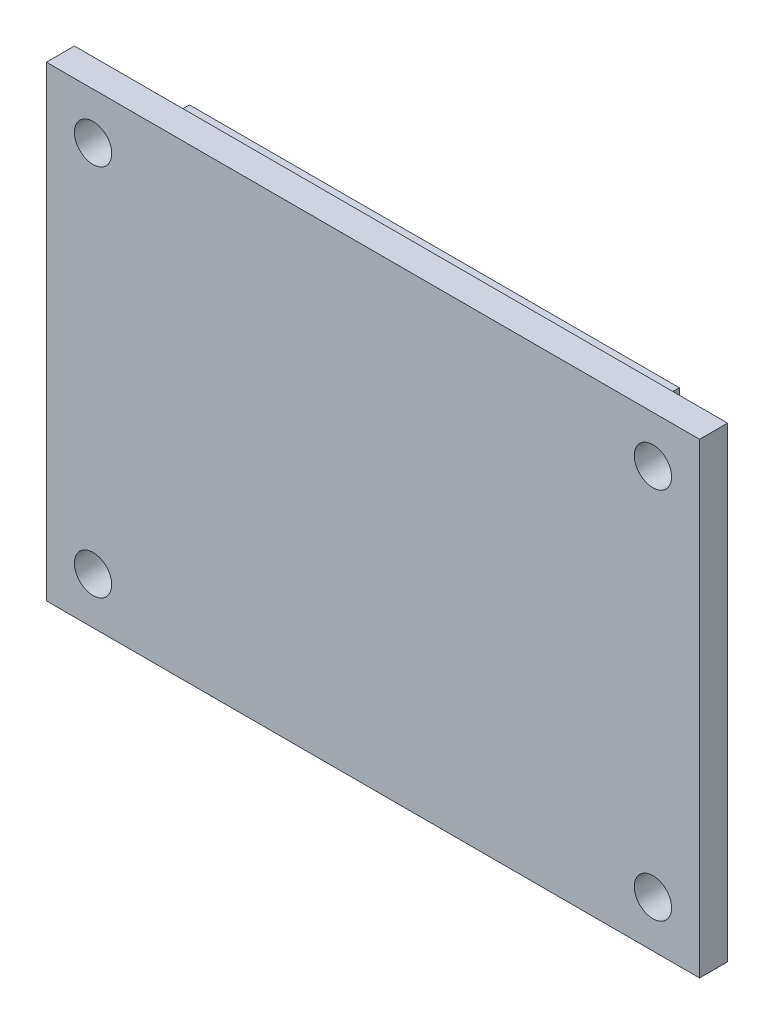
ISO-10303-21;
HEADER;
FILE_DESCRIPTION(('STEP AP214'),'2;1');
FILE_NAME('part.step','',(''),(''),'','','');
FILE_SCHEMA(('AUTOMOTIVE_DESIGN { 1 0 10303 214 1 1 1 1 }'));
ENDSEC;
DATA;
#1=APPLICATION_CONTEXT('core data for automotive mechanical design processes');
#2=APPLICATION_PROTOCOL_DEFINITION('international standard','automotive_design',2000,#1);
#3=PRODUCT_CONTEXT('',#1,'mechanical');
#4=PRODUCT('Part','Part','',(#3));
#5=PRODUCT_RELATED_PRODUCT_CATEGORY('part','',(#4));
#6=PRODUCT_DEFINITION_FORMATION('','',#4);
#7=PRODUCT_DEFINITION_CONTEXT('part definition',#1,'design');
#8=PRODUCT_DEFINITION('design','',#6,#7);
#9=PRODUCT_DEFINITION_SHAPE('','',#8);
#10=(LENGTH_UNIT() NAMED_UNIT(*) SI_UNIT(.MILLI.,.METRE.));
#11=(NAMED_UNIT(*) PLANE_ANGLE_UNIT() SI_UNIT($,.RADIAN.));
#12=(NAMED_UNIT(*) SI_UNIT($,.STERADIAN.) SOLID_ANGLE_UNIT());
#13=UNCERTAINTY_MEASURE_WITH_UNIT(LENGTH_MEASURE(1.E-05),#10,'distance_accuracy_value','');
#14=(GEOMETRIC_REPRESENTATION_CONTEXT(3) GLOBAL_UNCERTAINTY_ASSIGNED_CONTEXT((#13)) GLOBAL_UNIT_ASSIGNED_CONTEXT((#10,
#11,#12)) REPRESENTATION_CONTEXT('',''));
#15=CARTESIAN_POINT('',(0.,0.,0.));
#16=DIRECTION('',(0.,0.,1.));
#17=DIRECTION('',(1.,0.,0.));
#18=AXIS2_PLACEMENT_3D('',#15,#16,#17);
#19=CARTESIAN_POINT('',(0.,0.,-26.));
#20=DIRECTION('',(0.,0.,1.));
#21=DIRECTION('',(1.,0.,0.));
#22=AXIS2_PLACEMENT_3D('',#19,#20,#21);
#23=PLANE('',#22);
#24=DIRECTION('',(0.,1.,0.));
#25=VECTOR('',#24,1.);
#26=CARTESIAN_POINT('',(-49.8285823288315,0.,-26.));
#27=LINE('',#26,#25);
#28=CARTESIAN_POINT('',(-49.8285823288315,-40.8047707864554,-26.));
#29=VERTEX_POINT('',#28);
#30=CARTESIAN_POINT('',(-49.8285823288315,9.19522921354461,-26.));
#31=VERTEX_POINT('',#30);
#32=EDGE_CURVE('E146',#29,#31,#27,.T.);
#33=ORIENTED_EDGE('',*,*,#32,.T.);
#34=DIRECTION('',(-1.,0.,0.));
#35=VECTOR('',#34,1.);
#36=CARTESIAN_POINT('',(0.,9.19522921354462,-26.));
#37=LINE('',#36,#35);
#38=CARTESIAN_POINT('',(20.1714176711685,9.19522921354462,-26.));
#39=VERTEX_POINT('',#38);
#40=EDGE_CURVE('E153',#39,#31,#37,.T.);
#41=ORIENTED_EDGE('',*,*,#40,.F.);
#42=DIRECTION('',(0.,1.,0.));
#43=VECTOR('',#42,1.);
#44=CARTESIAN_POINT('',(20.1714176711685,0.,-26.));
#45=LINE('',#44,#43);
#46=CARTESIAN_POINT('',(20.1714176711685,-40.8047707864554,-26.));
#47=VERTEX_POINT('',#46);
#48=EDGE_CURVE('E150',#47,#39,#45,.T.);
#49=ORIENTED_EDGE('',*,*,#48,.F.);
#50=DIRECTION('',(-1.,0.,0.));
#51=VECTOR('',#50,1.);
#52=CARTESIAN_POINT('',(0.,-40.8047707864554,-26.));
#53=LINE('',#52,#51);
#54=EDGE_CURVE('E148',#47,#29,#53,.T.);
#55=ORIENTED_EDGE('',*,*,#54,.T.);
#56=EDGE_LOOP('',(#33,#41,#49,#55));
#57=FACE_BOUND('',#56,.T.);
#58=CARTESIAN_POINT('',(15.1714176711685,-35.8047707864554,-26.));
#59=DIRECTION('',(0.,0.,1.));
#60=DIRECTION('',(1.,0.,0.));
#61=AXIS2_PLACEMENT_3D('',#58,#59,#60);
#62=CIRCLE('',#61,2.00000000000001);
#63=CARTESIAN_POINT('',(17.1714176711685,-35.8047707864554,-26.));
#64=VERTEX_POINT('',#63);
#65=EDGE_CURVE('E143',#64,#64,#62,.T.);
#66=ORIENTED_EDGE('',*,*,#65,.T.);
#67=EDGE_LOOP('',(#66));
#68=FACE_BOUND('',#67,.T.);
#69=CARTESIAN_POINT('',(-44.8285823288315,4.19522921354461,-26.));
#70=DIRECTION('',(0.,0.,1.));
#71=DIRECTION('',(1.,0.,0.));
#72=AXIS2_PLACEMENT_3D('',#69,#70,#71);
#73=CIRCLE('',#72,2.);
#74=CARTESIAN_POINT('',(-42.8285823288315,4.19522921354461,-26.));
#75=VERTEX_POINT('',#74);
#76=EDGE_CURVE('E140',#75,#75,#73,.T.);
#77=ORIENTED_EDGE('',*,*,#76,.T.);
#78=EDGE_LOOP('',(#77));
#79=FACE_BOUND('',#78,.T.);
#80=CARTESIAN_POINT('',(-44.8285823288315,-35.8047707864554,-26.));
#81=DIRECTION('',(0.,0.,1.));
#82=DIRECTION('',(1.,0.,0.));
#83=AXIS2_PLACEMENT_3D('',#80,#81,#82);
#84=CIRCLE('',#83,2.);
#85=CARTESIAN_POINT('',(-42.8285823288315,-35.8047707864554,-26.));
#86=VERTEX_POINT('',#85);
#87=EDGE_CURVE('E136',#86,#86,#84,.T.);
#88=ORIENTED_EDGE('',*,*,#87,.T.);
#89=EDGE_LOOP('',(#88));
#90=FACE_BOUND('',#89,.T.);
#91=CARTESIAN_POINT('',(15.1714176711685,4.19522921354461,-26.));
#92=DIRECTION('',(0.,0.,1.));
#93=DIRECTION('',(1.,0.,0.));
#94=AXIS2_PLACEMENT_3D('',#91,#92,#93);
#95=CIRCLE('',#94,2.00000000000001);
#96=CARTESIAN_POINT('',(17.1714176711685,4.19522921354461,-26.));
#97=VERTEX_POINT('',#96);
#98=EDGE_CURVE('E133',#97,#97,#95,.T.);
#99=ORIENTED_EDGE('',*,*,#98,.T.);
#100=EDGE_LOOP('',(#99));
#101=FACE_BOUND('',#100,.T.);
#102=DIRECTION('',(0.,-1.,0.));
#103=VECTOR('',#102,1.);
#104=CARTESIAN_POINT('',(10.1714176711685,-10.8047707864554,-26.));
#105=LINE('',#104,#103);
#106=CARTESIAN_POINT('',(10.1714176711685,5.06522921354461,-26.));
#107=VERTEX_POINT('',#106);
#108=CARTESIAN_POINT('',(10.1714176711685,-10.8047707864554,-26.));
#109=VERTEX_POINT('',#108);
#110=EDGE_CURVE('E123',#107,#109,#105,.T.);
#111=ORIENTED_EDGE('',*,*,#110,.F.);
#112=DIRECTION('',(1.,0.,0.));
#113=VECTOR('',#112,1.);
#114=CARTESIAN_POINT('',(10.1714176711685,5.06522921354461,-26.));
#115=LINE('',#114,#113);
#116=CARTESIAN_POINT('',(-42.3285823288315,5.06522921354461,-26.));
#117=VERTEX_POINT('',#116);
#118=EDGE_CURVE('E120',#117,#107,#115,.T.);
#119=ORIENTED_EDGE('',*,*,#118,.F.);
#120=DIRECTION('',(0.,1.,0.));
#121=VECTOR('',#120,1.);
#122=CARTESIAN_POINT('',(-42.3285823288315,-10.8047707864554,-26.));
#123=LINE('',#122,#121);
#124=CARTESIAN_POINT('',(-42.3285823288315,-10.8047707864554,-26.));
#125=VERTEX_POINT('',#124);
#126=EDGE_CURVE('E59',#125,#117,#123,.T.);
#127=ORIENTED_EDGE('',*,*,#126,.F.);
#128=DIRECTION('',(-1.,0.,0.));
#129=VECTOR('',#128,1.);
#130=CARTESIAN_POINT('',(10.1714176711685,-10.8047707864554,-26.));
#131=LINE('',#130,#129);
#132=EDGE_CURVE('E54',#109,#125,#131,.T.);
#133=ORIENTED_EDGE('',*,*,#132,.F.);
#134=EDGE_LOOP('',(#111,#119,#127,#133));
#135=FACE_BOUND('',#134,.T.);
#136=ADVANCED_FACE('F37',(#57,#68,#79,#90,#101,#135),#23,.F.);
#137=CARTESIAN_POINT('',(-49.8285823288315,0.,-26.));
#138=DIRECTION('',(1.,0.,0.));
#139=DIRECTION('',(0.,0.,-1.));
#140=AXIS2_PLACEMENT_3D('',#137,#138,#139);
#141=PLANE('',#140);
#142=DIRECTION('',(0.,1.,0.));
#143=VECTOR('',#142,1.);
#144=CARTESIAN_POINT('',(-49.8285823288315,0.,-23.));
#145=LINE('',#144,#143);
#146=CARTESIAN_POINT('',(-49.8285823288315,-40.8047707864554,-23.));
#147=VERTEX_POINT('',#146);
#148=CARTESIAN_POINT('',(-49.8285823288315,9.19522921354461,-23.));
#149=VERTEX_POINT('',#148);
#150=EDGE_CURVE('E164',#147,#149,#145,.T.);
#151=ORIENTED_EDGE('',*,*,#150,.T.);
#152=DIRECTION('',(0.,0.,1.));
#153=VECTOR('',#152,1.);
#154=CARTESIAN_POINT('',(-49.8285823288315,9.19522921354461,-26.));
#155=LINE('',#154,#153);
#156=EDGE_CURVE('E11',#31,#149,#155,.T.);
#157=ORIENTED_EDGE('',*,*,#156,.F.);
#158=ORIENTED_EDGE('',*,*,#32,.F.);
#159=DIRECTION('',(0.,0.,1.));
#160=VECTOR('',#159,1.);
#161=CARTESIAN_POINT('',(-49.8285823288315,-40.8047707864554,-26.));
#162=LINE('',#161,#160);
#163=EDGE_CURVE('E41',#29,#147,#162,.T.);
#164=ORIENTED_EDGE('',*,*,#163,.T.);
#165=EDGE_LOOP('',(#151,#157,#158,#164));
#166=FACE_BOUND('',#165,.T.);
#167=ADVANCED_FACE('F183',(#166),#141,.F.);
#168=CARTESIAN_POINT('',(0.,9.19522921354462,-26.));
#169=DIRECTION('',(0.,1.,0.));
#170=DIRECTION('',(-1.,0.,0.));
#171=AXIS2_PLACEMENT_3D('',#168,#169,#170);
#172=PLANE('',#171);
#173=DIRECTION('',(-1.,0.,0.));
#174=VECTOR('',#173,1.);
#175=CARTESIAN_POINT('',(0.,9.19522921354462,-23.));
#176=LINE('',#175,#174);
#177=CARTESIAN_POINT('',(20.1714176711685,9.19522921354462,-23.));
#178=VERTEX_POINT('',#177);
#179=EDGE_CURVE('E137',#178,#149,#176,.T.);
#180=ORIENTED_EDGE('',*,*,#179,.F.);
#181=DIRECTION('',(0.,0.,1.));
#182=VECTOR('',#181,1.);
#183=CARTESIAN_POINT('',(20.1714176711685,9.19522921354462,-26.));
#184=LINE('',#183,#182);
#185=EDGE_CURVE('E46',#39,#178,#184,.T.);
#186=ORIENTED_EDGE('',*,*,#185,.F.);
#187=ORIENTED_EDGE('',*,*,#40,.T.);
#188=ORIENTED_EDGE('',*,*,#156,.T.);
#189=EDGE_LOOP('',(#180,#186,#187,#188));
#190=FACE_BOUND('',#189,.T.);
#191=ADVANCED_FACE('F190',(#190),#172,.T.);
#192=CARTESIAN_POINT('',(20.1714176711685,0.,-26.));
#193=DIRECTION('',(1.,0.,0.));
#194=DIRECTION('',(0.,0.,-1.));
#195=AXIS2_PLACEMENT_3D('',#192,#193,#194);
#196=PLANE('',#195);
#197=DIRECTION('',(0.,1.,0.));
#198=VECTOR('',#197,1.);
#199=CARTESIAN_POINT('',(20.1714176711685,0.,-23.));
#200=LINE('',#199,#198);
#201=CARTESIAN_POINT('',(20.1714176711685,-40.8047707864554,-23.));
#202=VERTEX_POINT('',#201);
#203=EDGE_CURVE('E169',#202,#178,#200,.T.);
#204=ORIENTED_EDGE('',*,*,#203,.F.);
#205=DIRECTION('',(0.,0.,1.));
#206=VECTOR('',#205,1.);
#207=CARTESIAN_POINT('',(20.1714176711685,-40.8047707864554,-26.));
#208=LINE('',#207,#206);
#209=EDGE_CURVE('E174',#47,#202,#208,.T.);
#210=ORIENTED_EDGE('',*,*,#209,.F.);
#211=ORIENTED_EDGE('',*,*,#48,.T.);
#212=ORIENTED_EDGE('',*,*,#185,.T.);
#213=EDGE_LOOP('',(#204,#210,#211,#212));
#214=FACE_BOUND('',#213,.T.);
#215=ADVANCED_FACE('F217',(#214),#196,.T.);
#216=CARTESIAN_POINT('',(15.1714176711685,-35.8047707864554,-26.));
#217=DIRECTION('',(0.,0.,1.));
#218=DIRECTION('',(1.,0.,0.));
#219=AXIS2_PLACEMENT_3D('',#216,#217,#218);
#220=CYLINDRICAL_SURFACE('',#219,2.00000000000001);
#221=ORIENTED_EDGE('',*,*,#65,.F.);
#222=EDGE_LOOP('',(#221));
#223=FACE_BOUND('',#222,.T.);
#224=CARTESIAN_POINT('',(15.1714176711685,-35.8047707864554,-23.));
#225=DIRECTION('',(0.,0.,1.));
#226=DIRECTION('',(1.,0.,0.));
#227=AXIS2_PLACEMENT_3D('',#224,#225,#226);
#228=CIRCLE('',#227,2.00000000000001);
#229=CARTESIAN_POINT('',(17.1714176711685,-35.8047707864554,-23.));
#230=VERTEX_POINT('',#229);
#231=EDGE_CURVE('E161',#230,#230,#228,.T.);
#232=ORIENTED_EDGE('',*,*,#231,.T.);
#233=EDGE_LOOP('',(#232));
#234=FACE_BOUND('',#233,.T.);
#235=ADVANCED_FACE('F219',(#223,#234),#220,.F.);
#236=CARTESIAN_POINT('',(-44.8285823288315,4.19522921354461,-26.));
#237=DIRECTION('',(0.,0.,1.));
#238=DIRECTION('',(1.,0.,0.));
#239=AXIS2_PLACEMENT_3D('',#236,#237,#238);
#240=CYLINDRICAL_SURFACE('',#239,2.);
#241=ORIENTED_EDGE('',*,*,#76,.F.);
#242=EDGE_LOOP('',(#241));
#243=FACE_BOUND('',#242,.T.);
#244=CARTESIAN_POINT('',(-44.8285823288315,4.19522921354461,-23.));
#245=DIRECTION('',(0.,0.,1.));
#246=DIRECTION('',(1.,0.,0.));
#247=AXIS2_PLACEMENT_3D('',#244,#245,#246);
#248=CIRCLE('',#247,2.);
#249=CARTESIAN_POINT('',(-42.8285823288315,4.19522921354461,-23.));
#250=VERTEX_POINT('',#249);
#251=EDGE_CURVE('E158',#250,#250,#248,.T.);
#252=ORIENTED_EDGE('',*,*,#251,.T.);
#253=EDGE_LOOP('',(#252));
#254=FACE_BOUND('',#253,.T.);
#255=ADVANCED_FACE('F224',(#243,#254),#240,.F.);
#256=CARTESIAN_POINT('',(-44.8285823288315,-35.8047707864554,-26.));
#257=DIRECTION('',(0.,0.,1.));
#258=DIRECTION('',(1.,0.,0.));
#259=AXIS2_PLACEMENT_3D('',#256,#257,#258);
#260=CYLINDRICAL_SURFACE('',#259,2.);
#261=ORIENTED_EDGE('',*,*,#87,.F.);
#262=EDGE_LOOP('',(#261));
#263=FACE_BOUND('',#262,.T.);
#264=CARTESIAN_POINT('',(-44.8285823288315,-35.8047707864554,-23.));
#265=DIRECTION('',(0.,0.,1.));
#266=DIRECTION('',(1.,0.,0.));
#267=AXIS2_PLACEMENT_3D('',#264,#265,#266);
#268=CIRCLE('',#267,2.);
#269=CARTESIAN_POINT('',(-42.8285823288315,-35.8047707864554,-23.));
#270=VERTEX_POINT('',#269);
#271=EDGE_CURVE('E127',#270,#270,#268,.T.);
#272=ORIENTED_EDGE('',*,*,#271,.T.);
#273=EDGE_LOOP('',(#272));
#274=FACE_BOUND('',#273,.T.);
#275=ADVANCED_FACE('F204',(#263,#274),#260,.F.);
#276=CARTESIAN_POINT('',(15.1714176711685,4.19522921354461,-26.));
#277=DIRECTION('',(0.,0.,1.));
#278=DIRECTION('',(1.,0.,0.));
#279=AXIS2_PLACEMENT_3D('',#276,#277,#278);
#280=CYLINDRICAL_SURFACE('',#279,2.00000000000001);
#281=ORIENTED_EDGE('',*,*,#98,.F.);
#282=EDGE_LOOP('',(#281));
#283=FACE_BOUND('',#282,.T.);
#284=CARTESIAN_POINT('',(15.1714176711685,4.19522921354461,-23.));
#285=DIRECTION('',(0.,0.,1.));
#286=DIRECTION('',(1.,0.,0.));
#287=AXIS2_PLACEMENT_3D('',#284,#285,#286);
#288=CIRCLE('',#287,2.00000000000001);
#289=CARTESIAN_POINT('',(17.1714176711685,4.19522921354461,-23.));
#290=VERTEX_POINT('',#289);
#291=EDGE_CURVE('E124',#290,#290,#288,.T.);
#292=ORIENTED_EDGE('',*,*,#291,.T.);
#293=EDGE_LOOP('',(#292));
#294=FACE_BOUND('',#293,.T.);
#295=ADVANCED_FACE('F39',(#283,#294),#280,.F.);
#296=CARTESIAN_POINT('',(0.,-40.8047707864554,-26.));
#297=DIRECTION('',(0.,1.,0.));
#298=DIRECTION('',(-1.,0.,0.));
#299=AXIS2_PLACEMENT_3D('',#296,#297,#298);
#300=PLANE('',#299);
#301=DIRECTION('',(-1.,0.,0.));
#302=VECTOR('',#301,1.);
#303=CARTESIAN_POINT('',(0.,-40.8047707864554,-23.));
#304=LINE('',#303,#302);
#305=EDGE_CURVE('E167',#202,#147,#304,.T.);
#306=ORIENTED_EDGE('',*,*,#305,.T.);
#307=ORIENTED_EDGE('',*,*,#163,.F.);
#308=ORIENTED_EDGE('',*,*,#54,.F.);
#309=ORIENTED_EDGE('',*,*,#209,.T.);
#310=EDGE_LOOP('',(#306,#307,#308,#309));
#311=FACE_BOUND('',#310,.T.);
#312=ADVANCED_FACE('F195',(#311),#300,.F.);
#313=CARTESIAN_POINT('',(0.,0.,-23.));
#314=DIRECTION('',(0.,0.,1.));
#315=DIRECTION('',(1.,0.,0.));
#316=AXIS2_PLACEMENT_3D('',#313,#314,#315);
#317=PLANE('',#316);
#318=ORIENTED_EDGE('',*,*,#291,.F.);
#319=EDGE_LOOP('',(#318));
#320=FACE_BOUND('',#319,.T.);
#321=ORIENTED_EDGE('',*,*,#271,.F.);
#322=EDGE_LOOP('',(#321));
#323=FACE_BOUND('',#322,.T.);
#324=ORIENTED_EDGE('',*,*,#251,.F.);
#325=EDGE_LOOP('',(#324));
#326=FACE_BOUND('',#325,.T.);
#327=ORIENTED_EDGE('',*,*,#231,.F.);
#328=EDGE_LOOP('',(#327));
#329=FACE_BOUND('',#328,.T.);
#330=ORIENTED_EDGE('',*,*,#150,.F.);
#331=ORIENTED_EDGE('',*,*,#305,.F.);
#332=ORIENTED_EDGE('',*,*,#203,.T.);
#333=ORIENTED_EDGE('',*,*,#179,.T.);
#334=EDGE_LOOP('',(#330,#331,#332,#333));
#335=FACE_BOUND('',#334,.T.);
#336=ADVANCED_FACE('F186',(#320,#323,#326,#329,#335),#317,.T.);
#337=CARTESIAN_POINT('',(10.1714176711685,-10.8047707864554,-30.83));
#338=DIRECTION('',(-1.,0.,0.));
#339=DIRECTION('',(0.,-1.,0.));
#340=AXIS2_PLACEMENT_3D('',#337,#338,#339);
#341=PLANE('',#340);
#342=ORIENTED_EDGE('',*,*,#110,.T.);
#343=DIRECTION('',(0.,0.,1.));
#344=VECTOR('',#343,1.);
#345=CARTESIAN_POINT('',(10.1714176711685,-10.8047707864554,-30.83));
#346=LINE('',#345,#344);
#347=CARTESIAN_POINT('',(10.1714176711685,-10.8047707864554,-30.83));
#348=VERTEX_POINT('',#347);
#349=EDGE_CURVE('E104',#348,#109,#346,.T.);
#350=ORIENTED_EDGE('',*,*,#349,.F.);
#351=DIRECTION('',(0.,-1.,0.));
#352=VECTOR('',#351,1.);
#353=CARTESIAN_POINT('',(10.1714176711685,-10.8047707864554,-30.83));
#354=LINE('',#353,#352);
#355=CARTESIAN_POINT('',(10.1714176711685,5.06522921354461,-30.83));
#356=VERTEX_POINT('',#355);
#357=EDGE_CURVE('E111',#356,#348,#354,.T.);
#358=ORIENTED_EDGE('',*,*,#357,.F.);
#359=DIRECTION('',(0.,0.,1.));
#360=VECTOR('',#359,1.);
#361=CARTESIAN_POINT('',(10.1714176711685,5.06522921354461,-30.83));
#362=LINE('',#361,#360);
#363=EDGE_CURVE('E255',#356,#107,#362,.T.);
#364=ORIENTED_EDGE('',*,*,#363,.T.);
#365=EDGE_LOOP('',(#342,#350,#358,#364));
#366=FACE_BOUND('',#365,.T.);
#367=ADVANCED_FACE('F122',(#366),#341,.F.);
#368=CARTESIAN_POINT('',(10.1714176711685,-10.8047707864554,-30.83));
#369=DIRECTION('',(0.,1.,0.));
#370=DIRECTION('',(0.,0.,1.));
#371=AXIS2_PLACEMENT_3D('',#368,#369,#370);
#372=PLANE('',#371);
#373=ORIENTED_EDGE('',*,*,#132,.T.);
#374=DIRECTION('',(0.,0.,1.));
#375=VECTOR('',#374,1.);
#376=CARTESIAN_POINT('',(-42.3285823288315,-10.8047707864554,-30.83));
#377=LINE('',#376,#375);
#378=CARTESIAN_POINT('',(-42.3285823288315,-10.8047707864554,-30.83));
#379=VERTEX_POINT('',#378);
#380=EDGE_CURVE('E107',#379,#125,#377,.T.);
#381=ORIENTED_EDGE('',*,*,#380,.F.);
#382=DIRECTION('',(-1.,0.,0.));
#383=VECTOR('',#382,1.);
#384=CARTESIAN_POINT('',(10.1714176711685,-10.8047707864554,-30.83));
#385=LINE('',#384,#383);
#386=EDGE_CURVE('E100',#348,#379,#385,.T.);
#387=ORIENTED_EDGE('',*,*,#386,.F.);
#388=ORIENTED_EDGE('',*,*,#349,.T.);
#389=EDGE_LOOP('',(#373,#381,#387,#388));
#390=FACE_BOUND('',#389,.T.);
#391=ADVANCED_FACE('F102',(#390),#372,.F.);
#392=CARTESIAN_POINT('',(-42.3285823288315,-10.8047707864554,-30.83));
#393=DIRECTION('',(1.,0.,0.));
#394=DIRECTION('',(0.,0.,-1.));
#395=AXIS2_PLACEMENT_3D('',#392,#393,#394);
#396=PLANE('',#395);
#397=ORIENTED_EDGE('',*,*,#126,.T.);
#398=DIRECTION('',(0.,0.,1.));
#399=VECTOR('',#398,1.);
#400=CARTESIAN_POINT('',(-42.3285823288315,5.06522921354461,-30.83));
#401=LINE('',#400,#399);
#402=CARTESIAN_POINT('',(-42.3285823288315,5.06522921354461,-30.83));
#403=VERTEX_POINT('',#402);
#404=EDGE_CURVE('E129',#403,#117,#401,.T.);
#405=ORIENTED_EDGE('',*,*,#404,.F.);
#406=DIRECTION('',(0.,1.,0.));
#407=VECTOR('',#406,1.);
#408=CARTESIAN_POINT('',(-42.3285823288315,-10.8047707864554,-30.83));
#409=LINE('',#408,#407);
#410=EDGE_CURVE('E110',#379,#403,#409,.T.);
#411=ORIENTED_EDGE('',*,*,#410,.F.);
#412=ORIENTED_EDGE('',*,*,#380,.T.);
#413=EDGE_LOOP('',(#397,#405,#411,#412));
#414=FACE_BOUND('',#413,.T.);
#415=ADVANCED_FACE('F264',(#414),#396,.F.);
#416=CARTESIAN_POINT('',(10.1714176711685,5.06522921354461,-30.83));
#417=DIRECTION('',(0.,-1.,0.));
#418=DIRECTION('',(0.,0.,-1.));
#419=AXIS2_PLACEMENT_3D('',#416,#417,#418);
#420=PLANE('',#419);
#421=ORIENTED_EDGE('',*,*,#118,.T.);
#422=ORIENTED_EDGE('',*,*,#363,.F.);
#423=DIRECTION('',(1.,0.,0.));
#424=VECTOR('',#423,1.);
#425=CARTESIAN_POINT('',(10.1714176711685,5.06522921354461,-30.83));
#426=LINE('',#425,#424);
#427=EDGE_CURVE('E116',#403,#356,#426,.T.);
#428=ORIENTED_EDGE('',*,*,#427,.F.);
#429=ORIENTED_EDGE('',*,*,#404,.T.);
#430=EDGE_LOOP('',(#421,#422,#428,#429));
#431=FACE_BOUND('',#430,.T.);
#432=ADVANCED_FACE('F254',(#431),#420,.F.);
#433=CARTESIAN_POINT('',(0.,0.,-30.83));
#434=DIRECTION('',(0.,0.,1.));
#435=DIRECTION('',(1.,0.,0.));
#436=AXIS2_PLACEMENT_3D('',#433,#434,#435);
#437=PLANE('',#436);
#438=ORIENTED_EDGE('',*,*,#357,.T.);
#439=ORIENTED_EDGE('',*,*,#386,.T.);
#440=ORIENTED_EDGE('',*,*,#410,.T.);
#441=ORIENTED_EDGE('',*,*,#427,.T.);
#442=EDGE_LOOP('',(#438,#439,#440,#441));
#443=FACE_BOUND('',#442,.T.);
#444=ADVANCED_FACE('F114',(#443),#437,.F.);
#445=CLOSED_SHELL('',(#136,#167,#191,#215,#235,#255,#275,#295,#312,#336,#367,#391,#415,#432,#444));
#446=MANIFOLD_SOLID_BREP('B2',#445);
#447=ADVANCED_BREP_SHAPE_REPRESENTATION('',(#18,#446),#14);
#448=SHAPE_DEFINITION_REPRESENTATION(#9,#447);
ENDSEC;
END-ISO-10303-21;
